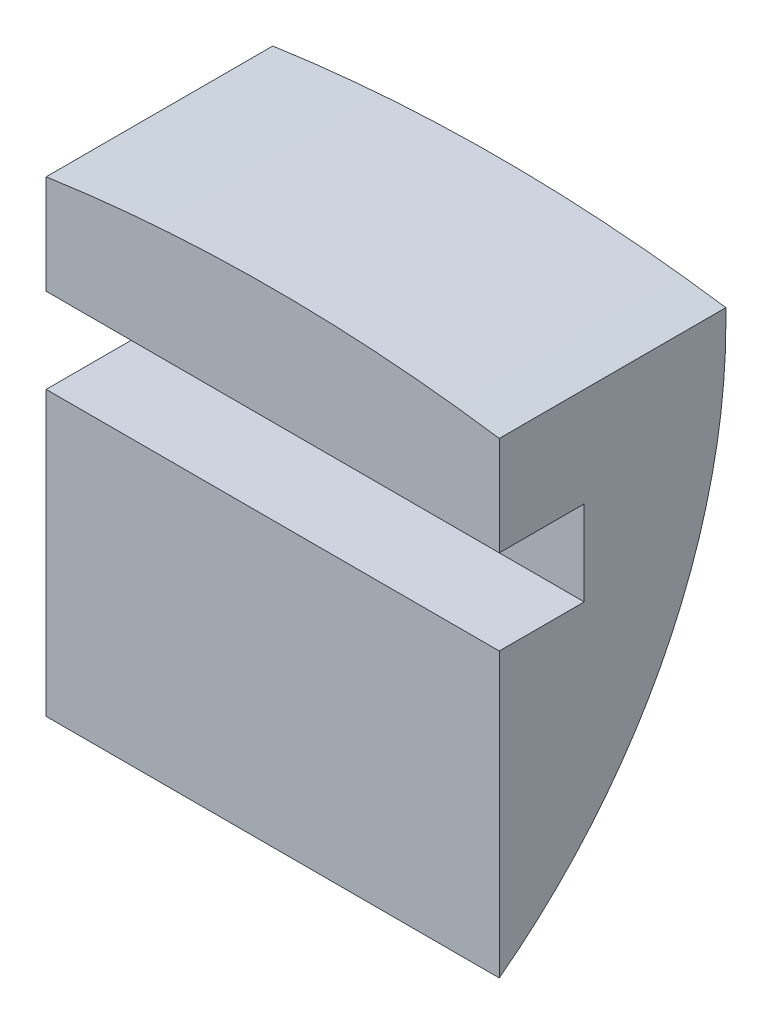
ISO-10303-21;
HEADER;
FILE_DESCRIPTION(('STEP AP214'),'2;1');
FILE_NAME('part.step','',(''),(''),'','','');
FILE_SCHEMA(('AUTOMOTIVE_DESIGN { 1 0 10303 214 1 1 1 1 }'));
ENDSEC;
DATA;
#1=APPLICATION_CONTEXT('core data for automotive mechanical design processes');
#2=APPLICATION_PROTOCOL_DEFINITION('international standard','automotive_design',2000,#1);
#3=PRODUCT_CONTEXT('',#1,'mechanical');
#4=PRODUCT('Part','Part','',(#3));
#5=PRODUCT_RELATED_PRODUCT_CATEGORY('part','',(#4));
#6=PRODUCT_DEFINITION_FORMATION('','',#4);
#7=PRODUCT_DEFINITION_CONTEXT('part definition',#1,'design');
#8=PRODUCT_DEFINITION('design','',#6,#7);
#9=PRODUCT_DEFINITION_SHAPE('','',#8);
#10=(LENGTH_UNIT() NAMED_UNIT(*) SI_UNIT(.MILLI.,.METRE.));
#11=(NAMED_UNIT(*) PLANE_ANGLE_UNIT() SI_UNIT($,.RADIAN.));
#12=(NAMED_UNIT(*) SI_UNIT($,.STERADIAN.) SOLID_ANGLE_UNIT());
#13=UNCERTAINTY_MEASURE_WITH_UNIT(LENGTH_MEASURE(1.E-05),#10,'distance_accuracy_value','');
#14=(GEOMETRIC_REPRESENTATION_CONTEXT(3) GLOBAL_UNCERTAINTY_ASSIGNED_CONTEXT((#13)) GLOBAL_UNIT_ASSIGNED_CONTEXT((#10,
#11,#12)) REPRESENTATION_CONTEXT('',''));
#15=CARTESIAN_POINT('',(0.,0.,0.));
#16=DIRECTION('',(0.,0.,1.));
#17=DIRECTION('',(1.,0.,0.));
#18=AXIS2_PLACEMENT_3D('',#15,#16,#17);
#19=CARTESIAN_POINT('',(0.,0.,4.));
#20=DIRECTION('',(0.,0.,1.));
#21=DIRECTION('',(1.,0.,0.));
#22=AXIS2_PLACEMENT_3D('',#19,#20,#21);
#23=PLANE('',#22);
#24=DIRECTION('',(1.,0.,0.));
#25=VECTOR('',#24,1.);
#26=CARTESIAN_POINT('',(-4.,-0.75,4.));
#27=LINE('',#26,#25);
#28=CARTESIAN_POINT('',(-4.,-0.75,4.));
#29=VERTEX_POINT('',#28);
#30=CARTESIAN_POINT('',(4.,-0.75,4.));
#31=VERTEX_POINT('',#30);
#32=EDGE_CURVE('E108',#29,#31,#27,.T.);
#33=ORIENTED_EDGE('',*,*,#32,.F.);
#34=DIRECTION('',(0.,-1.,0.));
#35=VECTOR('',#34,1.);
#36=CARTESIAN_POINT('',(-4.,2.5,4.));
#37=LINE('',#36,#35);
#38=CARTESIAN_POINT('',(-3.99999999999999,-5.75,4.));
#39=VERTEX_POINT('',#38);
#40=EDGE_CURVE('E99',#29,#39,#37,.T.);
#41=ORIENTED_EDGE('',*,*,#40,.T.);
#42=DIRECTION('',(1.,0.,0.));
#43=VECTOR('',#42,1.);
#44=CARTESIAN_POINT('',(-3.99999999999999,-5.75,4.));
#45=LINE('',#44,#43);
#46=CARTESIAN_POINT('',(4.,-5.75,4.));
#47=VERTEX_POINT('',#46);
#48=EDGE_CURVE('E107',#39,#47,#45,.T.);
#49=ORIENTED_EDGE('',*,*,#48,.T.);
#50=DIRECTION('',(0.,1.,0.));
#51=VECTOR('',#50,1.);
#52=CARTESIAN_POINT('',(4.,2.5,4.));
#53=LINE('',#52,#51);
#54=EDGE_CURVE('E110',#47,#31,#53,.T.);
#55=ORIENTED_EDGE('',*,*,#54,.T.);
#56=EDGE_LOOP('',(#33,#41,#49,#55));
#57=FACE_BOUND('',#56,.T.);
#58=ADVANCED_FACE('F33',(#57),#23,.T.);
#59=CARTESIAN_POINT('',(4.,2.5,4.));
#60=DIRECTION('',(-1.,0.,0.));
#61=DIRECTION('',(0.,0.,1.));
#62=AXIS2_PLACEMENT_3D('',#59,#60,#61);
#63=PLANE('',#62);
#64=ORIENTED_EDGE('',*,*,#54,.F.);
#65=CARTESIAN_POINT('',(4.,2.25,10.));
#66=DIRECTION('',(-1.,0.,0.));
#67=DIRECTION('',(0.,0.,1.));
#68=AXIS2_PLACEMENT_3D('',#65,#66,#67);
#69=CIRCLE('',#68,10.);
#70=CARTESIAN_POINT('',(4.,2.25,0.));
#71=VERTEX_POINT('',#70);
#72=EDGE_CURVE('E11',#47,#71,#69,.F.);
#73=ORIENTED_EDGE('',*,*,#72,.T.);
#74=DIRECTION('',(0.,1.,0.));
#75=VECTOR('',#74,1.);
#76=CARTESIAN_POINT('',(4.,2.5,0.));
#77=LINE('',#76,#75);
#78=CARTESIAN_POINT('',(4.,2.5,0.));
#79=VERTEX_POINT('',#78);
#80=EDGE_CURVE('E138',#71,#79,#77,.T.);
#81=ORIENTED_EDGE('',*,*,#80,.T.);
#82=DIRECTION('',(0.,0.,-1.));
#83=VECTOR('',#82,1.);
#84=CARTESIAN_POINT('',(4.,2.5,4.));
#85=LINE('',#84,#83);
#86=CARTESIAN_POINT('',(4.,2.5,4.));
#87=VERTEX_POINT('',#86);
#88=EDGE_CURVE('E152',#87,#79,#85,.T.);
#89=ORIENTED_EDGE('',*,*,#88,.F.);
#90=CARTESIAN_POINT('',(4.,0.75,4.));
#91=VERTEX_POINT('',#90);
#92=EDGE_CURVE('E145',#91,#87,#53,.T.);
#93=ORIENTED_EDGE('',*,*,#92,.F.);
#94=DIRECTION('',(0.,0.,1.));
#95=VECTOR('',#94,1.);
#96=CARTESIAN_POINT('',(4.,0.75,2.5));
#97=LINE('',#96,#95);
#98=CARTESIAN_POINT('',(4.,0.75,2.5));
#99=VERTEX_POINT('',#98);
#100=EDGE_CURVE('E132',#99,#91,#97,.T.);
#101=ORIENTED_EDGE('',*,*,#100,.F.);
#102=DIRECTION('',(0.,1.,0.));
#103=VECTOR('',#102,1.);
#104=CARTESIAN_POINT('',(4.,0.75,2.5));
#105=LINE('',#104,#103);
#106=CARTESIAN_POINT('',(4.,-0.75,2.5));
#107=VERTEX_POINT('',#106);
#108=EDGE_CURVE('E121',#107,#99,#105,.T.);
#109=ORIENTED_EDGE('',*,*,#108,.F.);
#110=DIRECTION('',(0.,0.,1.));
#111=VECTOR('',#110,1.);
#112=CARTESIAN_POINT('',(4.,-0.75,2.5));
#113=LINE('',#112,#111);
#114=EDGE_CURVE('E135',#107,#31,#113,.T.);
#115=ORIENTED_EDGE('',*,*,#114,.T.);
#116=EDGE_LOOP('',(#64,#73,#81,#89,#93,#101,#109,#115));
#117=FACE_BOUND('',#116,.T.);
#118=ADVANCED_FACE('F159',(#117),#63,.F.);
#119=CARTESIAN_POINT('',(-4.,2.5,4.));
#120=DIRECTION('',(1.,0.,0.));
#121=DIRECTION('',(0.,1.,0.));
#122=AXIS2_PLACEMENT_3D('',#119,#120,#121);
#123=PLANE('',#122);
#124=DIRECTION('',(0.,-1.,0.));
#125=VECTOR('',#124,1.);
#126=CARTESIAN_POINT('',(-4.,2.5,0.));
#127=LINE('',#126,#125);
#128=CARTESIAN_POINT('',(-4.,2.5,0.));
#129=VERTEX_POINT('',#128);
#130=CARTESIAN_POINT('',(-4.,2.25,0.));
#131=VERTEX_POINT('',#130);
#132=EDGE_CURVE('E101',#129,#131,#127,.T.);
#133=ORIENTED_EDGE('',*,*,#132,.T.);
#134=CARTESIAN_POINT('',(-4.,2.25,10.));
#135=DIRECTION('',(1.,0.,0.));
#136=DIRECTION('',(0.,1.,0.));
#137=AXIS2_PLACEMENT_3D('',#134,#135,#136);
#138=CIRCLE('',#137,10.);
#139=EDGE_CURVE('E41',#131,#39,#138,.F.);
#140=ORIENTED_EDGE('',*,*,#139,.T.);
#141=ORIENTED_EDGE('',*,*,#40,.F.);
#142=DIRECTION('',(0.,0.,1.));
#143=VECTOR('',#142,1.);
#144=CARTESIAN_POINT('',(-4.,-0.75,2.5));
#145=LINE('',#144,#143);
#146=CARTESIAN_POINT('',(-4.,-0.75,2.5));
#147=VERTEX_POINT('',#146);
#148=EDGE_CURVE('E139',#147,#29,#145,.T.);
#149=ORIENTED_EDGE('',*,*,#148,.F.);
#150=DIRECTION('',(0.,-1.,0.));
#151=VECTOR('',#150,1.);
#152=CARTESIAN_POINT('',(-4.,0.75,2.5));
#153=LINE('',#152,#151);
#154=CARTESIAN_POINT('',(-4.,0.75,2.5));
#155=VERTEX_POINT('',#154);
#156=EDGE_CURVE('E127',#155,#147,#153,.T.);
#157=ORIENTED_EDGE('',*,*,#156,.F.);
#158=DIRECTION('',(0.,0.,1.));
#159=VECTOR('',#158,1.);
#160=CARTESIAN_POINT('',(-4.,0.75,2.5));
#161=LINE('',#160,#159);
#162=CARTESIAN_POINT('',(-4.,0.75,4.));
#163=VERTEX_POINT('',#162);
#164=EDGE_CURVE('E141',#155,#163,#161,.T.);
#165=ORIENTED_EDGE('',*,*,#164,.T.);
#166=CARTESIAN_POINT('',(-4.,2.5,4.));
#167=VERTEX_POINT('',#166);
#168=EDGE_CURVE('E109',#167,#163,#37,.T.);
#169=ORIENTED_EDGE('',*,*,#168,.F.);
#170=DIRECTION('',(0.,0.,-1.));
#171=VECTOR('',#170,1.);
#172=CARTESIAN_POINT('',(-4.,2.5,4.));
#173=LINE('',#172,#171);
#174=EDGE_CURVE('E148',#167,#129,#173,.T.);
#175=ORIENTED_EDGE('',*,*,#174,.T.);
#176=EDGE_LOOP('',(#133,#140,#141,#149,#157,#165,#169,#175));
#177=FACE_BOUND('',#176,.T.);
#178=ADVANCED_FACE('F97',(#177),#123,.F.);
#179=DIRECTION('',(-1.,0.,0.));
#180=VECTOR('',#179,1.);
#181=CARTESIAN_POINT('',(-4.,0.75,4.));
#182=LINE('',#181,#180);
#183=EDGE_CURVE('E119',#91,#163,#182,.T.);
#184=ORIENTED_EDGE('',*,*,#183,.F.);
#185=ORIENTED_EDGE('',*,*,#92,.T.);
#186=CARTESIAN_POINT('',(0.,-24.7075357208256,4.));
#187=DIRECTION('',(0.,0.,1.));
#188=DIRECTION('',(-1.,0.,0.));
#189=AXIS2_PLACEMENT_3D('',#186,#187,#188);
#190=CIRCLE('',#189,27.5);
#191=EDGE_CURVE('E112',#87,#167,#190,.T.);
#192=ORIENTED_EDGE('',*,*,#191,.T.);
#193=ORIENTED_EDGE('',*,*,#168,.T.);
#194=EDGE_LOOP('',(#184,#185,#192,#193));
#195=FACE_BOUND('',#194,.T.);
#196=ADVANCED_FACE('F168',(#195),#23,.T.);
#197=CARTESIAN_POINT('',(0.,0.,0.));
#198=DIRECTION('',(0.,0.,1.));
#199=DIRECTION('',(1.,0.,0.));
#200=AXIS2_PLACEMENT_3D('',#197,#198,#199);
#201=PLANE('',#200);
#202=ORIENTED_EDGE('',*,*,#80,.F.);
#203=DIRECTION('',(-1.,0.,0.));
#204=VECTOR('',#203,1.);
#205=CARTESIAN_POINT('',(0.,2.25,0.));
#206=LINE('',#205,#204);
#207=EDGE_CURVE('E102',#71,#131,#206,.T.);
#208=ORIENTED_EDGE('',*,*,#207,.T.);
#209=ORIENTED_EDGE('',*,*,#132,.F.);
#210=CARTESIAN_POINT('',(0.,-24.7075357208256,0.));
#211=DIRECTION('',(0.,0.,1.));
#212=DIRECTION('',(1.,0.,0.));
#213=AXIS2_PLACEMENT_3D('',#210,#211,#212);
#214=CIRCLE('',#213,27.5);
#215=EDGE_CURVE('E115',#129,#79,#214,.F.);
#216=ORIENTED_EDGE('',*,*,#215,.T.);
#217=EDGE_LOOP('',(#202,#208,#209,#216));
#218=FACE_BOUND('',#217,.T.);
#219=ADVANCED_FACE('F156',(#218),#201,.F.);
#220=CARTESIAN_POINT('',(-4.,-0.75,2.5));
#221=DIRECTION('',(0.,-1.,0.));
#222=DIRECTION('',(0.,0.,-1.));
#223=AXIS2_PLACEMENT_3D('',#220,#221,#222);
#224=PLANE('',#223);
#225=ORIENTED_EDGE('',*,*,#32,.T.);
#226=ORIENTED_EDGE('',*,*,#114,.F.);
#227=DIRECTION('',(1.,0.,0.));
#228=VECTOR('',#227,1.);
#229=CARTESIAN_POINT('',(-4.,-0.75,2.5));
#230=LINE('',#229,#228);
#231=EDGE_CURVE('E129',#147,#107,#230,.T.);
#232=ORIENTED_EDGE('',*,*,#231,.F.);
#233=ORIENTED_EDGE('',*,*,#148,.T.);
#234=EDGE_LOOP('',(#225,#226,#232,#233));
#235=FACE_BOUND('',#234,.T.);
#236=ADVANCED_FACE('F177',(#235),#224,.F.);
#237=CARTESIAN_POINT('',(-4.,0.75,2.5));
#238=DIRECTION('',(0.,1.,0.));
#239=DIRECTION('',(0.,0.,1.));
#240=AXIS2_PLACEMENT_3D('',#237,#238,#239);
#241=PLANE('',#240);
#242=ORIENTED_EDGE('',*,*,#183,.T.);
#243=ORIENTED_EDGE('',*,*,#164,.F.);
#244=DIRECTION('',(-1.,0.,0.));
#245=VECTOR('',#244,1.);
#246=CARTESIAN_POINT('',(-4.,0.75,2.5));
#247=LINE('',#246,#245);
#248=EDGE_CURVE('E124',#99,#155,#247,.T.);
#249=ORIENTED_EDGE('',*,*,#248,.F.);
#250=ORIENTED_EDGE('',*,*,#100,.T.);
#251=EDGE_LOOP('',(#242,#243,#249,#250));
#252=FACE_BOUND('',#251,.T.);
#253=ADVANCED_FACE('F170',(#252),#241,.F.);
#254=CARTESIAN_POINT('',(0.,0.,2.5));
#255=DIRECTION('',(0.,0.,1.));
#256=DIRECTION('',(1.,0.,0.));
#257=AXIS2_PLACEMENT_3D('',#254,#255,#256);
#258=PLANE('',#257);
#259=ORIENTED_EDGE('',*,*,#108,.T.);
#260=ORIENTED_EDGE('',*,*,#248,.T.);
#261=ORIENTED_EDGE('',*,*,#156,.T.);
#262=ORIENTED_EDGE('',*,*,#231,.T.);
#263=EDGE_LOOP('',(#259,#260,#261,#262));
#264=FACE_BOUND('',#263,.T.);
#265=ADVANCED_FACE('F174',(#264),#258,.T.);
#266=CARTESIAN_POINT('',(0.,-24.7075357208256,-9.4339811320566));
#267=DIRECTION('',(0.,0.,1.));
#268=DIRECTION('',(1.,0.,0.));
#269=AXIS2_PLACEMENT_3D('',#266,#267,#268);
#270=CYLINDRICAL_SURFACE('',#269,27.5);
#271=ORIENTED_EDGE('',*,*,#215,.F.);
#272=ORIENTED_EDGE('',*,*,#174,.F.);
#273=ORIENTED_EDGE('',*,*,#191,.F.);
#274=ORIENTED_EDGE('',*,*,#88,.T.);
#275=EDGE_LOOP('',(#271,#272,#273,#274));
#276=FACE_BOUND('',#275,.T.);
#277=ADVANCED_FACE('F165',(#276),#270,.T.);
#278=CARTESIAN_POINT('',(-3.99999999999999,2.25,10.));
#279=DIRECTION('',(-1.,0.,0.));
#280=DIRECTION('',(0.,0.,1.));
#281=AXIS2_PLACEMENT_3D('',#278,#279,#280);
#282=CYLINDRICAL_SURFACE('',#281,10.);
#283=ORIENTED_EDGE('',*,*,#72,.F.);
#284=ORIENTED_EDGE('',*,*,#48,.F.);
#285=ORIENTED_EDGE('',*,*,#139,.F.);
#286=ORIENTED_EDGE('',*,*,#207,.F.);
#287=EDGE_LOOP('',(#283,#284,#285,#286));
#288=FACE_BOUND('',#287,.T.);
#289=ADVANCED_FACE('F35',(#288),#282,.T.);
#290=CLOSED_SHELL('',(#58,#118,#178,#196,#219,#236,#253,#265,#277,#289));
#291=MANIFOLD_SOLID_BREP('B2',#290);
#292=ADVANCED_BREP_SHAPE_REPRESENTATION('',(#18,#291),#14);
#293=SHAPE_DEFINITION_REPRESENTATION(#9,#292);
ENDSEC;
END-ISO-10303-21;
